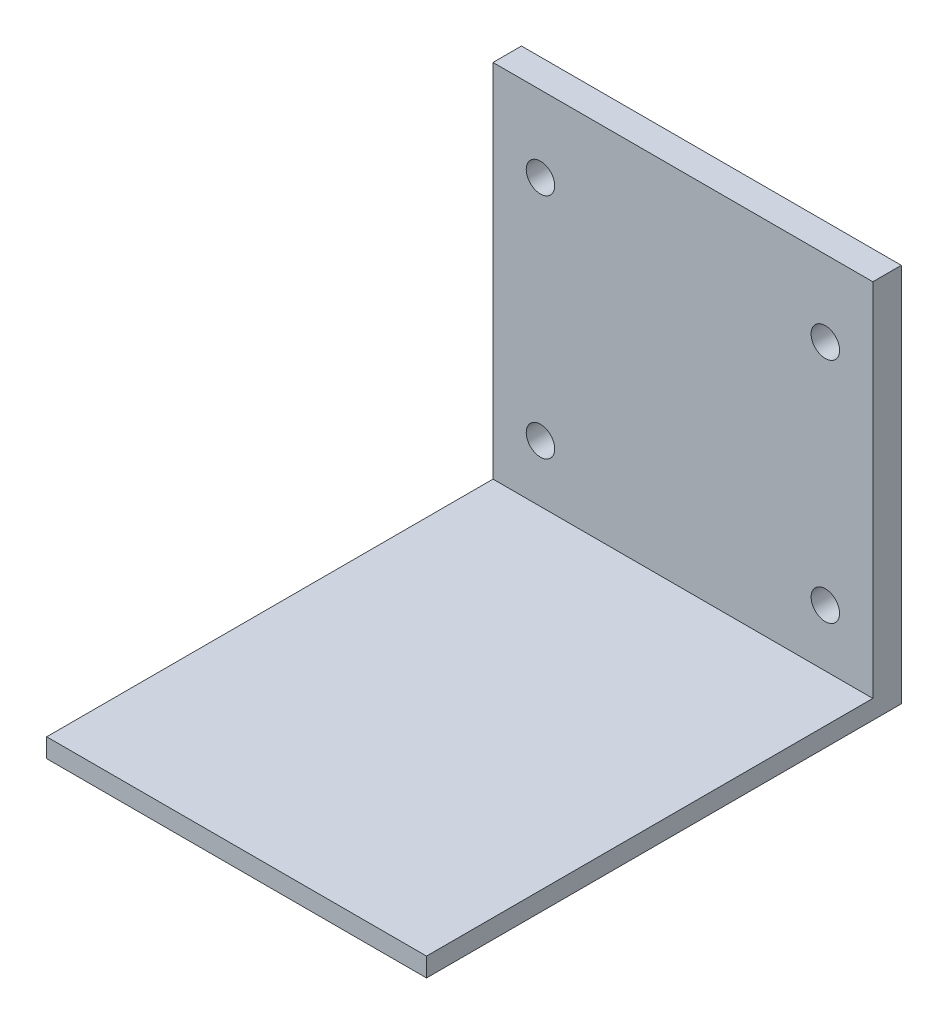
ISO-10303-21;
HEADER;
FILE_DESCRIPTION(('STEP AP214'),'2;1');
FILE_NAME('part.step','',(''),(''),'','','');
FILE_SCHEMA(('AUTOMOTIVE_DESIGN { 1 0 10303 214 1 1 1 1 }'));
ENDSEC;
DATA;
#1=APPLICATION_CONTEXT('core data for automotive mechanical design processes');
#2=APPLICATION_PROTOCOL_DEFINITION('international standard','automotive_design',2000,#1);
#3=PRODUCT_CONTEXT('',#1,'mechanical');
#4=PRODUCT('Part','Part','',(#3));
#5=PRODUCT_RELATED_PRODUCT_CATEGORY('part','',(#4));
#6=PRODUCT_DEFINITION_FORMATION('','',#4);
#7=PRODUCT_DEFINITION_CONTEXT('part definition',#1,'design');
#8=PRODUCT_DEFINITION('design','',#6,#7);
#9=PRODUCT_DEFINITION_SHAPE('','',#8);
#10=(LENGTH_UNIT() NAMED_UNIT(*) SI_UNIT(.MILLI.,.METRE.));
#11=(NAMED_UNIT(*) PLANE_ANGLE_UNIT() SI_UNIT($,.RADIAN.));
#12=(NAMED_UNIT(*) SI_UNIT($,.STERADIAN.) SOLID_ANGLE_UNIT());
#13=UNCERTAINTY_MEASURE_WITH_UNIT(LENGTH_MEASURE(1.E-05),#10,'distance_accuracy_value','');
#14=(GEOMETRIC_REPRESENTATION_CONTEXT(3) GLOBAL_UNCERTAINTY_ASSIGNED_CONTEXT((#13)) GLOBAL_UNIT_ASSIGNED_CONTEXT((#10,
#11,#12)) REPRESENTATION_CONTEXT('',''));
#15=CARTESIAN_POINT('',(0.,0.,0.));
#16=DIRECTION('',(0.,0.,1.));
#17=DIRECTION('',(1.,0.,0.));
#18=AXIS2_PLACEMENT_3D('',#15,#16,#17);
#19=CARTESIAN_POINT('',(0.,0.,3.));
#20=DIRECTION('',(1.,0.,0.));
#21=DIRECTION('',(0.,1.,0.));
#22=AXIS2_PLACEMENT_3D('',#19,#20,#21);
#23=PLANE('',#22);
#24=DIRECTION('',(0.,-1.,0.));
#25=VECTOR('',#24,1.);
#26=CARTESIAN_POINT('',(0.,0.,0.));
#27=LINE('',#26,#25);
#28=CARTESIAN_POINT('',(0.,0.,0.));
#29=VERTEX_POINT('',#28);
#30=CARTESIAN_POINT('',(0.,-40.,0.));
#31=VERTEX_POINT('',#30);
#32=EDGE_CURVE('E92',#29,#31,#27,.T.);
#33=ORIENTED_EDGE('',*,*,#32,.T.);
#34=DIRECTION('',(0.,0.,-1.));
#35=VECTOR('',#34,1.);
#36=CARTESIAN_POINT('',(0.,-40.,3.));
#37=LINE('',#36,#35);
#38=CARTESIAN_POINT('',(0.,-40.,50.));
#39=VERTEX_POINT('',#38);
#40=EDGE_CURVE('E11',#39,#31,#37,.T.);
#41=ORIENTED_EDGE('',*,*,#40,.F.);
#42=DIRECTION('',(0.,-1.,0.));
#43=VECTOR('',#42,1.);
#44=CARTESIAN_POINT('',(0.,-40.,50.));
#45=LINE('',#44,#43);
#46=CARTESIAN_POINT('',(0.,-38.,50.));
#47=VERTEX_POINT('',#46);
#48=EDGE_CURVE('E128',#47,#39,#45,.T.);
#49=ORIENTED_EDGE('',*,*,#48,.F.);
#50=DIRECTION('',(0.,0.,-1.));
#51=VECTOR('',#50,1.);
#52=CARTESIAN_POINT('',(0.,-38.,50.));
#53=LINE('',#52,#51);
#54=CARTESIAN_POINT('',(0.,-38.,3.));
#55=VERTEX_POINT('',#54);
#56=EDGE_CURVE('E129',#47,#55,#53,.T.);
#57=ORIENTED_EDGE('',*,*,#56,.T.);
#58=DIRECTION('',(0.,-1.,0.));
#59=VECTOR('',#58,1.);
#60=CARTESIAN_POINT('',(0.,0.,3.));
#61=LINE('',#60,#59);
#62=CARTESIAN_POINT('',(0.,0.,3.));
#63=VERTEX_POINT('',#62);
#64=EDGE_CURVE('E86',#63,#55,#61,.T.);
#65=ORIENTED_EDGE('',*,*,#64,.F.);
#66=DIRECTION('',(0.,0.,-1.));
#67=VECTOR('',#66,1.);
#68=CARTESIAN_POINT('',(0.,0.,3.));
#69=LINE('',#68,#67);
#70=EDGE_CURVE('E79',#63,#29,#69,.T.);
#71=ORIENTED_EDGE('',*,*,#70,.T.);
#72=EDGE_LOOP('',(#33,#41,#49,#57,#65,#71));
#73=FACE_BOUND('',#72,.T.);
#74=ADVANCED_FACE('F37',(#73),#23,.F.);
#75=CARTESIAN_POINT('',(0.,-40.,3.));
#76=DIRECTION('',(0.,1.,0.));
#77=DIRECTION('',(0.,0.,1.));
#78=AXIS2_PLACEMENT_3D('',#75,#76,#77);
#79=PLANE('',#78);
#80=DIRECTION('',(1.,0.,0.));
#81=VECTOR('',#80,1.);
#82=CARTESIAN_POINT('',(0.,-40.,0.));
#83=LINE('',#82,#81);
#84=CARTESIAN_POINT('',(40.,-40.,0.));
#85=VERTEX_POINT('',#84);
#86=EDGE_CURVE('E96',#31,#85,#83,.T.);
#87=ORIENTED_EDGE('',*,*,#86,.T.);
#88=DIRECTION('',(0.,0.,-1.));
#89=VECTOR('',#88,1.);
#90=CARTESIAN_POINT('',(40.,-40.,3.));
#91=LINE('',#90,#89);
#92=CARTESIAN_POINT('',(40.,-40.,50.));
#93=VERTEX_POINT('',#92);
#94=EDGE_CURVE('E44',#93,#85,#91,.T.);
#95=ORIENTED_EDGE('',*,*,#94,.F.);
#96=DIRECTION('',(1.,0.,0.));
#97=VECTOR('',#96,1.);
#98=CARTESIAN_POINT('',(40.,-40.,50.));
#99=LINE('',#98,#97);
#100=EDGE_CURVE('E120',#39,#93,#99,.T.);
#101=ORIENTED_EDGE('',*,*,#100,.F.);
#102=ORIENTED_EDGE('',*,*,#40,.T.);
#103=EDGE_LOOP('',(#87,#95,#101,#102));
#104=FACE_BOUND('',#103,.T.);
#105=ADVANCED_FACE('F118',(#104),#79,.F.);
#106=CARTESIAN_POINT('',(40.,0.,3.));
#107=DIRECTION('',(-1.,0.,0.));
#108=DIRECTION('',(0.,-1.,0.));
#109=AXIS2_PLACEMENT_3D('',#106,#107,#108);
#110=PLANE('',#109);
#111=DIRECTION('',(0.,1.,0.));
#112=VECTOR('',#111,1.);
#113=CARTESIAN_POINT('',(40.,0.,0.));
#114=LINE('',#113,#112);
#115=CARTESIAN_POINT('',(40.,0.,0.));
#116=VERTEX_POINT('',#115);
#117=EDGE_CURVE('E87',#85,#116,#114,.T.);
#118=ORIENTED_EDGE('',*,*,#117,.T.);
#119=DIRECTION('',(0.,0.,-1.));
#120=VECTOR('',#119,1.);
#121=CARTESIAN_POINT('',(40.,0.,3.));
#122=LINE('',#121,#120);
#123=CARTESIAN_POINT('',(40.,0.,3.));
#124=VERTEX_POINT('',#123);
#125=EDGE_CURVE('E82',#124,#116,#122,.T.);
#126=ORIENTED_EDGE('',*,*,#125,.F.);
#127=DIRECTION('',(0.,1.,0.));
#128=VECTOR('',#127,1.);
#129=CARTESIAN_POINT('',(40.,0.,3.));
#130=LINE('',#129,#128);
#131=CARTESIAN_POINT('',(40.,-38.,3.));
#132=VERTEX_POINT('',#131);
#133=EDGE_CURVE('E160',#132,#124,#130,.T.);
#134=ORIENTED_EDGE('',*,*,#133,.F.);
#135=DIRECTION('',(0.,0.,-1.));
#136=VECTOR('',#135,1.);
#137=CARTESIAN_POINT('',(40.,-38.,50.));
#138=LINE('',#137,#136);
#139=CARTESIAN_POINT('',(40.,-38.,50.));
#140=VERTEX_POINT('',#139);
#141=EDGE_CURVE('E131',#140,#132,#138,.T.);
#142=ORIENTED_EDGE('',*,*,#141,.F.);
#143=DIRECTION('',(0.,1.,0.));
#144=VECTOR('',#143,1.);
#145=CARTESIAN_POINT('',(40.,-40.,50.));
#146=LINE('',#145,#144);
#147=EDGE_CURVE('E114',#93,#140,#146,.T.);
#148=ORIENTED_EDGE('',*,*,#147,.F.);
#149=ORIENTED_EDGE('',*,*,#94,.T.);
#150=EDGE_LOOP('',(#118,#126,#134,#142,#148,#149));
#151=FACE_BOUND('',#150,.T.);
#152=ADVANCED_FACE('F111',(#151),#110,.F.);
#153=CARTESIAN_POINT('',(0.,0.,3.));
#154=DIRECTION('',(0.,-1.,0.));
#155=DIRECTION('',(0.,0.,-1.));
#156=AXIS2_PLACEMENT_3D('',#153,#154,#155);
#157=PLANE('',#156);
#158=DIRECTION('',(-1.,0.,0.));
#159=VECTOR('',#158,1.);
#160=CARTESIAN_POINT('',(0.,0.,0.));
#161=LINE('',#160,#159);
#162=EDGE_CURVE('E76',#116,#29,#161,.T.);
#163=ORIENTED_EDGE('',*,*,#162,.T.);
#164=ORIENTED_EDGE('',*,*,#70,.F.);
#165=DIRECTION('',(-1.,0.,0.));
#166=VECTOR('',#165,1.);
#167=CARTESIAN_POINT('',(0.,0.,3.));
#168=LINE('',#167,#166);
#169=EDGE_CURVE('E57',#124,#63,#168,.T.);
#170=ORIENTED_EDGE('',*,*,#169,.F.);
#171=ORIENTED_EDGE('',*,*,#125,.T.);
#172=EDGE_LOOP('',(#163,#164,#170,#171));
#173=FACE_BOUND('',#172,.T.);
#174=ADVANCED_FACE('F78',(#173),#157,.F.);
#175=CARTESIAN_POINT('',(0.,0.,3.));
#176=DIRECTION('',(0.,0.,1.));
#177=DIRECTION('',(1.,0.,0.));
#178=AXIS2_PLACEMENT_3D('',#175,#176,#177);
#179=PLANE('',#178);
#180=DIRECTION('',(-1.,0.,0.));
#181=VECTOR('',#180,1.);
#182=CARTESIAN_POINT('',(40.,-38.,3.));
#183=LINE('',#182,#181);
#184=EDGE_CURVE('E51',#132,#55,#183,.T.);
#185=ORIENTED_EDGE('',*,*,#184,.F.);
#186=ORIENTED_EDGE('',*,*,#133,.T.);
#187=ORIENTED_EDGE('',*,*,#169,.T.);
#188=ORIENTED_EDGE('',*,*,#64,.T.);
#189=EDGE_LOOP('',(#185,#186,#187,#188));
#190=FACE_BOUND('',#189,.T.);
#191=CARTESIAN_POINT('',(5.,-8.,3.));
#192=DIRECTION('',(0.,0.,1.));
#193=DIRECTION('',(-1.,0.,0.));
#194=AXIS2_PLACEMENT_3D('',#191,#192,#193);
#195=CIRCLE('',#194,1.5);
#196=CARTESIAN_POINT('',(3.5,-8.,3.));
#197=VERTEX_POINT('',#196);
#198=EDGE_CURVE('E147',#197,#197,#195,.T.);
#199=ORIENTED_EDGE('',*,*,#198,.F.);
#200=EDGE_LOOP('',(#199));
#201=FACE_BOUND('',#200,.T.);
#202=CARTESIAN_POINT('',(35.,-32.,3.));
#203=DIRECTION('',(0.,0.,1.));
#204=DIRECTION('',(1.,0.,0.));
#205=AXIS2_PLACEMENT_3D('',#202,#203,#204);
#206=CIRCLE('',#205,1.5);
#207=CARTESIAN_POINT('',(36.5,-32.,3.));
#208=VERTEX_POINT('',#207);
#209=EDGE_CURVE('E153',#208,#208,#206,.T.);
#210=ORIENTED_EDGE('',*,*,#209,.F.);
#211=EDGE_LOOP('',(#210));
#212=FACE_BOUND('',#211,.T.);
#213=CARTESIAN_POINT('',(5.,-32.,3.));
#214=DIRECTION('',(0.,0.,1.));
#215=DIRECTION('',(-1.,0.,0.));
#216=AXIS2_PLACEMENT_3D('',#213,#214,#215);
#217=CIRCLE('',#216,1.5);
#218=CARTESIAN_POINT('',(3.49999999999999,-32.,3.));
#219=VERTEX_POINT('',#218);
#220=EDGE_CURVE('E141',#219,#219,#217,.T.);
#221=ORIENTED_EDGE('',*,*,#220,.F.);
#222=EDGE_LOOP('',(#221));
#223=FACE_BOUND('',#222,.T.);
#224=CARTESIAN_POINT('',(35.,-8.,3.));
#225=DIRECTION('',(0.,0.,1.));
#226=DIRECTION('',(1.,0.,0.));
#227=AXIS2_PLACEMENT_3D('',#224,#225,#226);
#228=CIRCLE('',#227,1.5);
#229=CARTESIAN_POINT('',(36.5,-8.,3.));
#230=VERTEX_POINT('',#229);
#231=EDGE_CURVE('E101',#230,#230,#228,.T.);
#232=ORIENTED_EDGE('',*,*,#231,.F.);
#233=EDGE_LOOP('',(#232));
#234=FACE_BOUND('',#233,.T.);
#235=ADVANCED_FACE('F161',(#190,#201,#212,#223,#234),#179,.T.);
#236=CARTESIAN_POINT('',(0.,0.,0.));
#237=DIRECTION('',(0.,0.,1.));
#238=DIRECTION('',(1.,0.,0.));
#239=AXIS2_PLACEMENT_3D('',#236,#237,#238);
#240=PLANE('',#239);
#241=CARTESIAN_POINT('',(5.,-8.,0.));
#242=DIRECTION('',(0.,0.,1.));
#243=DIRECTION('',(-1.,0.,0.));
#244=AXIS2_PLACEMENT_3D('',#241,#242,#243);
#245=CIRCLE('',#244,1.5);
#246=CARTESIAN_POINT('',(3.5,-8.,0.));
#247=VERTEX_POINT('',#246);
#248=EDGE_CURVE('E150',#247,#247,#245,.T.);
#249=ORIENTED_EDGE('',*,*,#248,.T.);
#250=EDGE_LOOP('',(#249));
#251=FACE_BOUND('',#250,.T.);
#252=CARTESIAN_POINT('',(35.,-32.,0.));
#253=DIRECTION('',(0.,0.,1.));
#254=DIRECTION('',(1.,0.,0.));
#255=AXIS2_PLACEMENT_3D('',#252,#253,#254);
#256=CIRCLE('',#255,1.5);
#257=CARTESIAN_POINT('',(36.5,-32.,0.));
#258=VERTEX_POINT('',#257);
#259=EDGE_CURVE('E144',#258,#258,#256,.T.);
#260=ORIENTED_EDGE('',*,*,#259,.T.);
#261=EDGE_LOOP('',(#260));
#262=FACE_BOUND('',#261,.T.);
#263=CARTESIAN_POINT('',(5.,-32.,0.));
#264=DIRECTION('',(0.,0.,1.));
#265=DIRECTION('',(-1.,0.,0.));
#266=AXIS2_PLACEMENT_3D('',#263,#264,#265);
#267=CIRCLE('',#266,1.5);
#268=CARTESIAN_POINT('',(3.49999999999999,-32.,0.));
#269=VERTEX_POINT('',#268);
#270=EDGE_CURVE('E140',#269,#269,#267,.T.);
#271=ORIENTED_EDGE('',*,*,#270,.T.);
#272=EDGE_LOOP('',(#271));
#273=FACE_BOUND('',#272,.T.);
#274=CARTESIAN_POINT('',(35.,-8.,0.));
#275=DIRECTION('',(0.,0.,1.));
#276=DIRECTION('',(1.,0.,0.));
#277=AXIS2_PLACEMENT_3D('',#274,#275,#276);
#278=CIRCLE('',#277,1.5);
#279=CARTESIAN_POINT('',(36.5,-8.,0.));
#280=VERTEX_POINT('',#279);
#281=EDGE_CURVE('E97',#280,#280,#278,.T.);
#282=ORIENTED_EDGE('',*,*,#281,.T.);
#283=EDGE_LOOP('',(#282));
#284=FACE_BOUND('',#283,.T.);
#285=ORIENTED_EDGE('',*,*,#32,.F.);
#286=ORIENTED_EDGE('',*,*,#162,.F.);
#287=ORIENTED_EDGE('',*,*,#117,.F.);
#288=ORIENTED_EDGE('',*,*,#86,.F.);
#289=EDGE_LOOP('',(#285,#286,#287,#288));
#290=FACE_BOUND('',#289,.T.);
#291=ADVANCED_FACE('F95',(#251,#262,#273,#284,#290),#240,.F.);
#292=CARTESIAN_POINT('',(35.,-8.,0.));
#293=DIRECTION('',(0.,0.,1.));
#294=DIRECTION('',(1.,0.,0.));
#295=AXIS2_PLACEMENT_3D('',#292,#293,#294);
#296=CYLINDRICAL_SURFACE('',#295,1.5);
#297=ORIENTED_EDGE('',*,*,#281,.F.);
#298=EDGE_LOOP('',(#297));
#299=FACE_BOUND('',#298,.T.);
#300=ORIENTED_EDGE('',*,*,#231,.T.);
#301=EDGE_LOOP('',(#300));
#302=FACE_BOUND('',#301,.T.);
#303=ADVANCED_FACE('F198',(#299,#302),#296,.F.);
#304=CARTESIAN_POINT('',(5.,-32.,0.));
#305=DIRECTION('',(0.,0.,1.));
#306=DIRECTION('',(1.,0.,0.));
#307=AXIS2_PLACEMENT_3D('',#304,#305,#306);
#308=CYLINDRICAL_SURFACE('',#307,1.5);
#309=ORIENTED_EDGE('',*,*,#270,.F.);
#310=EDGE_LOOP('',(#309));
#311=FACE_BOUND('',#310,.T.);
#312=ORIENTED_EDGE('',*,*,#220,.T.);
#313=EDGE_LOOP('',(#312));
#314=FACE_BOUND('',#313,.T.);
#315=ADVANCED_FACE('F204',(#311,#314),#308,.F.);
#316=CARTESIAN_POINT('',(35.,-32.,0.));
#317=DIRECTION('',(0.,0.,1.));
#318=DIRECTION('',(1.,0.,0.));
#319=AXIS2_PLACEMENT_3D('',#316,#317,#318);
#320=CYLINDRICAL_SURFACE('',#319,1.5);
#321=ORIENTED_EDGE('',*,*,#259,.F.);
#322=EDGE_LOOP('',(#321));
#323=FACE_BOUND('',#322,.T.);
#324=ORIENTED_EDGE('',*,*,#209,.T.);
#325=EDGE_LOOP('',(#324));
#326=FACE_BOUND('',#325,.T.);
#327=ADVANCED_FACE('F181',(#323,#326),#320,.F.);
#328=CARTESIAN_POINT('',(5.,-8.,0.));
#329=DIRECTION('',(0.,0.,1.));
#330=DIRECTION('',(1.,0.,0.));
#331=AXIS2_PLACEMENT_3D('',#328,#329,#330);
#332=CYLINDRICAL_SURFACE('',#331,1.5);
#333=ORIENTED_EDGE('',*,*,#248,.F.);
#334=EDGE_LOOP('',(#333));
#335=FACE_BOUND('',#334,.T.);
#336=ORIENTED_EDGE('',*,*,#198,.T.);
#337=EDGE_LOOP('',(#336));
#338=FACE_BOUND('',#337,.T.);
#339=ADVANCED_FACE('F174',(#335,#338),#332,.F.);
#340=CARTESIAN_POINT('',(40.,-38.,50.));
#341=DIRECTION('',(0.,-1.,0.));
#342=DIRECTION('',(1.,0.,0.));
#343=AXIS2_PLACEMENT_3D('',#340,#341,#342);
#344=PLANE('',#343);
#345=ORIENTED_EDGE('',*,*,#184,.T.);
#346=ORIENTED_EDGE('',*,*,#56,.F.);
#347=DIRECTION('',(-1.,0.,0.));
#348=VECTOR('',#347,1.);
#349=CARTESIAN_POINT('',(40.,-38.,50.));
#350=LINE('',#349,#348);
#351=EDGE_CURVE('E133',#140,#47,#350,.T.);
#352=ORIENTED_EDGE('',*,*,#351,.F.);
#353=ORIENTED_EDGE('',*,*,#141,.T.);
#354=EDGE_LOOP('',(#345,#346,#352,#353));
#355=FACE_BOUND('',#354,.T.);
#356=ADVANCED_FACE('F165',(#355),#344,.F.);
#357=CARTESIAN_POINT('',(0.,0.,50.));
#358=DIRECTION('',(0.,0.,1.));
#359=DIRECTION('',(1.,0.,0.));
#360=AXIS2_PLACEMENT_3D('',#357,#358,#359);
#361=PLANE('',#360);
#362=ORIENTED_EDGE('',*,*,#147,.T.);
#363=ORIENTED_EDGE('',*,*,#351,.T.);
#364=ORIENTED_EDGE('',*,*,#48,.T.);
#365=ORIENTED_EDGE('',*,*,#100,.T.);
#366=EDGE_LOOP('',(#362,#363,#364,#365));
#367=FACE_BOUND('',#366,.T.);
#368=ADVANCED_FACE('F124',(#367),#361,.T.);
#369=CLOSED_SHELL('',(#74,#105,#152,#174,#235,#291,#303,#315,#327,#339,#356,#368));
#370=MANIFOLD_SOLID_BREP('B2',#369);
#371=ADVANCED_BREP_SHAPE_REPRESENTATION('',(#18,#370),#14);
#372=SHAPE_DEFINITION_REPRESENTATION(#9,#371);
ENDSEC;
END-ISO-10303-21;
